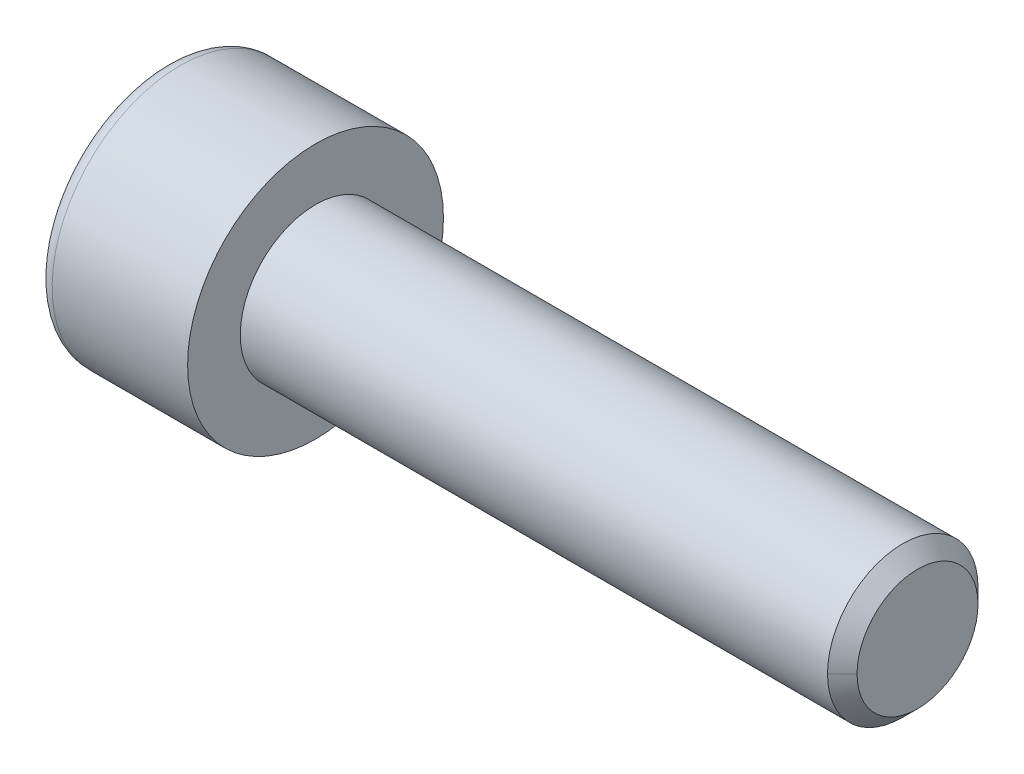
ISO-10303-21;
HEADER;
FILE_DESCRIPTION(('STEP AP214'),'2;1');
FILE_NAME('part.step','',(''),(''),'','','');
FILE_SCHEMA(('AUTOMOTIVE_DESIGN { 1 0 10303 214 1 1 1 1 }'));
ENDSEC;
DATA;
#1=APPLICATION_CONTEXT('core data for automotive mechanical design processes');
#2=APPLICATION_PROTOCOL_DEFINITION('international standard','automotive_design',2000,#1);
#3=PRODUCT_CONTEXT('',#1,'mechanical');
#4=PRODUCT('Part','Part','',(#3));
#5=PRODUCT_RELATED_PRODUCT_CATEGORY('part','',(#4));
#6=PRODUCT_DEFINITION_FORMATION('','',#4);
#7=PRODUCT_DEFINITION_CONTEXT('part definition',#1,'design');
#8=PRODUCT_DEFINITION('design','',#6,#7);
#9=PRODUCT_DEFINITION_SHAPE('','',#8);
#10=(LENGTH_UNIT() NAMED_UNIT(*) SI_UNIT(.MILLI.,.METRE.));
#11=(NAMED_UNIT(*) PLANE_ANGLE_UNIT() SI_UNIT($,.RADIAN.));
#12=(NAMED_UNIT(*) SI_UNIT($,.STERADIAN.) SOLID_ANGLE_UNIT());
#13=UNCERTAINTY_MEASURE_WITH_UNIT(LENGTH_MEASURE(1.E-05),#10,'distance_accuracy_value','');
#14=(GEOMETRIC_REPRESENTATION_CONTEXT(3) GLOBAL_UNCERTAINTY_ASSIGNED_CONTEXT((#13)) GLOBAL_UNIT_ASSIGNED_CONTEXT((#10,
#11,#12)) REPRESENTATION_CONTEXT('',''));
#15=CARTESIAN_POINT('',(0.,0.,0.));
#16=DIRECTION('',(0.,0.,1.));
#17=DIRECTION('',(1.,0.,0.));
#18=AXIS2_PLACEMENT_3D('',#15,#16,#17);
#19=CARTESIAN_POINT('',(20.,-2.03335088,-2.03335088));
#20=DIRECTION('',(1.,0.,0.));
#21=DIRECTION('',(0.,1.,0.));
#22=AXIS2_PLACEMENT_3D('',#19,#20,#21);
#23=PLANE('',#22);
#24=CARTESIAN_POINT('',(20.,0.,0.));
#25=DIRECTION('',(-1.,0.,0.));
#26=DIRECTION('',(0.,0.,1.));
#27=AXIS2_PLACEMENT_3D('',#24,#25,#26);
#28=CIRCLE('',#27,2.00924);
#29=CARTESIAN_POINT('',(20.,-6.86836687895245E-10,-2.00923999999999));
#30=VERTEX_POINT('',#29);
#31=CARTESIAN_POINT('',(20.,-2.40554743613248E-10,2.00923999999999));
#32=VERTEX_POINT('',#31);
#33=EDGE_CURVE('E88',#30,#32,#28,.F.);
#34=ORIENTED_EDGE('',*,*,#33,.T.);
#35=CARTESIAN_POINT('',(20.,0.,0.));
#36=DIRECTION('',(-1.,0.,0.));
#37=DIRECTION('',(0.,0.,1.));
#38=AXIS2_PLACEMENT_3D('',#35,#36,#37);
#39=CIRCLE('',#38,2.00924);
#40=EDGE_CURVE('E21',#32,#30,#39,.F.);
#41=ORIENTED_EDGE('',*,*,#40,.T.);
#42=EDGE_LOOP('',(#34,#41));
#43=FACE_BOUND('',#42,.T.);
#44=ADVANCED_FACE('F17',(#43),#23,.T.);
#45=CARTESIAN_POINT('',(20.,0.,2.00924));
#46=CARTESIAN_POINT('',(19.50924,0.,2.5));
#47=(BOUNDED_CURVE() B_SPLINE_CURVE(1,(#45,#46),.UNSPECIFIED.,.F.,
.F.) B_SPLINE_CURVE_WITH_KNOTS((2,2),(0.,1.00000000000004),
.UNSPECIFIED.) CURVE() GEOMETRIC_REPRESENTATION_ITEM() RATIONAL_B_SPLINE_CURVE((1.,1.)) REPRESENTATION_ITEM(''));
#48=CARTESIAN_POINT('',(1019.50924,0.,0.));
#49=DIRECTION('',(-1.,0.,0.));
#50=AXIS1_PLACEMENT('',#48,#49);
#51=SURFACE_OF_REVOLUTION('',#47,#50);
#52=ORIENTED_EDGE('',*,*,#40,.F.);
#53=DIRECTION('',(-0.707106781186547,-1.26986739101621E-10,0.707106781186548));
#54=VECTOR('',#53,1.);
#55=CARTESIAN_POINT('',(19.75462,-4.04899018551151E-10,2.25462));
#56=LINE('',#55,#54);
#57=CARTESIAN_POINT('',(19.50924,-2.244829608488E-10,2.49999999999995));
#58=VERTEX_POINT('',#57);
#59=EDGE_CURVE('E91',#32,#58,#56,.T.);
#60=ORIENTED_EDGE('',*,*,#59,.T.);
#61=CARTESIAN_POINT('',(19.5092400000001,0.,0.));
#62=DIRECTION('',(-1.,0.,0.));
#63=DIRECTION('',(0.,0.,1.));
#64=AXIS2_PLACEMENT_3D('',#61,#62,#63);
#65=CIRCLE('',#64,2.5);
#66=CARTESIAN_POINT('',(19.50924,-1.02551714257664E-09,-2.49999999999995));
#67=VERTEX_POINT('',#66);
#68=EDGE_CURVE('E95',#58,#67,#65,.F.);
#69=ORIENTED_EDGE('',*,*,#68,.T.);
#70=DIRECTION('',(0.707106781186547,2.90060050295602E-10,0.707106781186548));
#71=VECTOR('',#70,1.);
#72=CARTESIAN_POINT('',(19.75462,-9.24860583998472E-10,-2.25462));
#73=LINE('',#72,#71);
#74=EDGE_CURVE('E93',#67,#30,#73,.T.);
#75=ORIENTED_EDGE('',*,*,#74,.T.);
#76=EDGE_LOOP('',(#52,#60,#69,#75));
#77=FACE_BOUND('',#76,.T.);
#78=ADVANCED_FACE('F94',(#77),#51,.T.);
#79=CARTESIAN_POINT('',(20.0001414213562,0.,2.00909857864376));
#80=CARTESIAN_POINT('',(20.,0.,2.00924));
#81=CARTESIAN_POINT('',(19.50924,0.,2.5));
#82=(BOUNDED_CURVE() B_SPLINE_CURVE(1,(#79,#80,#81),.UNSPECIFIED.,.F.,
.F.) B_SPLINE_CURVE_WITH_KNOTS((2,1,2),(-0.00028816802109463,3.70846523719847E-11,1.),
.UNSPECIFIED.) CURVE() GEOMETRIC_REPRESENTATION_ITEM() RATIONAL_B_SPLINE_CURVE((1.,1.,1.)) REPRESENTATION_ITEM(''));
#83=CARTESIAN_POINT('',(1019.50924,0.,0.));
#84=DIRECTION('',(-1.,0.,0.));
#85=AXIS1_PLACEMENT('',#83,#84);
#86=SURFACE_OF_REVOLUTION('',#82,#85);
#87=ORIENTED_EDGE('',*,*,#74,.F.);
#88=CARTESIAN_POINT('',(19.5092400000001,0.,0.));
#89=DIRECTION('',(-1.,0.,0.));
#90=DIRECTION('',(0.,0.,1.));
#91=AXIS2_PLACEMENT_3D('',#88,#89,#90);
#92=CIRCLE('',#91,2.5);
#93=EDGE_CURVE('E108',#67,#58,#92,.F.);
#94=ORIENTED_EDGE('',*,*,#93,.T.);
#95=ORIENTED_EDGE('',*,*,#59,.F.);
#96=ORIENTED_EDGE('',*,*,#33,.F.);
#97=EDGE_LOOP('',(#87,#94,#95,#96));
#98=FACE_BOUND('',#97,.T.);
#99=ADVANCED_FACE('F101',(#98),#86,.T.);
#100=CARTESIAN_POINT('',(-1.166666666,0.,0.));
#101=CARTESIAN_POINT('',(-2.508,0.,2.323257483));
#102=(BOUNDED_CURVE() B_SPLINE_CURVE(1,(#100,#101),.UNSPECIFIED.,.F.,
.F.) B_SPLINE_CURVE_WITH_KNOTS((2,2),(0.,1.),
.UNSPECIFIED.) CURVE() GEOMETRIC_REPRESENTATION_ITEM() RATIONAL_B_SPLINE_CURVE((1.,1.)) REPRESENTATION_ITEM(''));
#103=CARTESIAN_POINT('',(997.492,0.,0.));
#104=DIRECTION('',(-1.,0.,0.));
#105=AXIS1_PLACEMENT('',#103,#104);
#106=SURFACE_OF_REVOLUTION('',#102,#105);
#107=CARTESIAN_POINT('',(-1.166666666,0.,0.));
#108=VERTEX_POINT('',#107);
#109=VERTEX_LOOP('',#108);
#110=FACE_BOUND('',#109,.T.);
#111=CARTESIAN_POINT('',(-2.49999999994076,-2.,-1.15470053775231));
#112=CARTESIAN_POINT('',(-2.48567655165512,-2.,-1.10507931773432));
#113=CARTESIAN_POINT('',(-2.47198871078964,-2.,-1.05526823641219));
#114=CARTESIAN_POINT('',(-2.44604690640692,-2.,-0.955218692575869));
#115=CARTESIAN_POINT('',(-2.43379447460794,-2.,-0.904979833791241));
#116=CARTESIAN_POINT('',(-2.41091380130688,-2.,-0.804117092943882));
#117=CARTESIAN_POINT('',(-2.40028604275163,-2.,-0.753493101073635));
#118=CARTESIAN_POINT('',(-2.37601016772818,-2.,-0.626639542162072));
#119=CARTESIAN_POINT('',(-2.36348630626666,-2.,-0.550189309523977));
#120=CARTESIAN_POINT('',(-2.34306885503139,-2.,-0.396671574205417));
#121=CARTESIAN_POINT('',(-2.33517516655927,-2.,-0.319604084718113));
#122=CARTESIAN_POINT('',(-2.32268432555711,-2.,-0.139619688842338));
#123=CARTESIAN_POINT('',(-2.32003239400898,-2.,-0.0365584864338747));
#124=CARTESIAN_POINT('',(-2.32397535370215,-2.,0.169407104774963));
#125=CARTESIAN_POINT('',(-2.33057305877728,-2.,0.272311436318865));
#126=CARTESIAN_POINT('',(-2.35234479113069,-2.,0.477116467372633));
#127=CARTESIAN_POINT('',(-2.36751355138492,-2.,0.579017744182629));
#128=CARTESIAN_POINT('',(-2.40514304704038,-2.,0.781457900875611));
#129=CARTESIAN_POINT('',(-2.42760505461591,-2.,0.881996539881626));
#130=CARTESIAN_POINT('',(-2.46035679018023,-2.,1.01073167838896));
#131=CARTESIAN_POINT('',(-2.46797293838578,-2.,1.03963527257175));
#132=CARTESIAN_POINT('',(-2.48365524704736,-2.,1.09727927796046));
#133=CARTESIAN_POINT('',(-2.49172080087081,-2.,1.12601985408537));
#134=CARTESIAN_POINT('',(-2.49999999998173,-2.,1.15470053789423));
#135=B_SPLINE_CURVE_WITH_KNOTS('',3,(#111,#112,#113,#114,#115,#116,#117,#118,#119,#120,#121,
#122,#123,#124,#125,#126,#127,#128,#129,#130,#131,#132,#133,#134),.UNSPECIFIED.,.F.,.F.,(4,2,2,
2,2,2,2,2,2,2,2,4),(0.,0.154946742163082,0.310057349590026,0.465213975574503,0.697487987448034,
0.929757047907446,1.23861321261436,1.54756335490868,1.85632384950566,2.16513823071313,
2.25480717406297,2.34435787914655),.UNSPECIFIED.);
#136=CARTESIAN_POINT('',(-2.4999999998186,-1.99999999993079,-1.15470053803996));
#137=VERTEX_POINT('',#136);
#138=CARTESIAN_POINT('',(-2.49999999995344,-1.99999999986934,1.15470053802255));
#139=VERTEX_POINT('',#138);
#140=EDGE_CURVE('E400',#137,#139,#135,.T.);
#141=ORIENTED_EDGE('',*,*,#140,.T.);
#142=CARTESIAN_POINT('',(-2.49999999992515,-1.99999999973868,1.15470053815087));
#143=CARTESIAN_POINT('',(-2.48567655163891,-1.95702676264271,1.17951114816952));
#144=CARTESIAN_POINT('',(-2.47198871077284,-1.91388910083416,1.20441668884029));
#145=CARTESIAN_POINT('',(-2.44604690638884,-1.82724365424769,1.25444146077793));
#146=CARTESIAN_POINT('',(-2.43379447458918,-1.78373552628951,1.27956089018003));
#147=CARTESIAN_POINT('',(-2.4109138012866,-1.6963858304333,1.32999226062335));
#148=CARTESIAN_POINT('',(-2.40028604273051,-1.65254416743919,1.35530425656833));
#149=CARTESIAN_POINT('',(-2.37601016770505,-1.54268576287784,1.41873103604867));
#150=CARTESIAN_POINT('',(-2.36348630624236,-1.47647791929806,1.45695615238246));
#151=CARTESIAN_POINT('',(-2.3430688550045,-1.34352766060085,1.5337150200714));
#152=CARTESIAN_POINT('',(-2.33517516653094,-1.27678525690902,1.57224876482995));
#153=CARTESIAN_POINT('',(-2.32268432552556,-1.1209141978217,1.66224096280127));
#154=CARTESIAN_POINT('',(-2.32003239397535,-1.03166057840722,1.71377156402406));
#155=CARTESIAN_POINT('',(-2.32397535366393,-0.853289144146355,1.81675435966568));
#156=CARTESIAN_POINT('',(-2.33057305873656,-0.764171378885523,1.86820652545626));
#157=CARTESIAN_POINT('',(-2.35234479108477,-0.586805019200706,1.97060904102052));
#158=CARTESIAN_POINT('',(-2.36751355133635,-0.498555924820148,2.02155967944427));
#159=CARTESIAN_POINT('',(-2.40514304698655,-0.32323760640756,2.12277975782806));
#160=CARTESIAN_POINT('',(-2.4276050545595,-0.236168590981107,2.17304907734962));
#161=CARTESIAN_POINT('',(-2.46035679014959,-0.124680690593866,2.23741664668419));
#162=CARTESIAN_POINT('',(-2.46797293838541,-0.0996494436766156,2.25186844383778));
#163=CARTESIAN_POINT('',(-2.48365524711095,-0.0497282704466456,2.28069044665586));
#164=CARTESIAN_POINT('',(-2.4917208009681,-0.024838201309885,2.29506073477984));
#165=CARTESIAN_POINT('',(-2.50000000011427,-4.40704641312993E-10,2.30940107674556));
#166=B_SPLINE_CURVE_WITH_KNOTS('',3,(#142,#143,#144,#145,#146,#147,#148,#149,#150,#151,#152,
#153,#154,#155,#156,#157,#158,#159,#160,#161,#162,#163,#164,#165),.UNSPECIFIED.,.F.,.F.,(4,2,2,
2,2,2,2,2,2,2,2,4),(0.,0.154946742161569,0.310057349586999,0.465213975569957,0.697487987440142,
0.929757047896212,1.23861321259006,1.54756335487124,1.85632384945638,2.16513823065216,
2.25480717435215,2.34435787978498),.UNSPECIFIED.);
#167=CARTESIAN_POINT('',(-2.50000000028077,-5.87977686074181E-11,2.30940107703395));
#168=VERTEX_POINT('',#167);
#169=EDGE_CURVE('E409',#139,#168,#166,.T.);
#170=ORIENTED_EDGE('',*,*,#169,.T.);
#171=CARTESIAN_POINT('',(-2.50000000016212,2.97141322209485E-10,2.30940107682845));
#172=CARTESIAN_POINT('',(-2.48567655186644,0.0429732373984809,2.2845904668067));
#173=CARTESIAN_POINT('',(-2.4719887109907,0.0861108992124214,2.25968492613282));
#174=CARTESIAN_POINT('',(-2.44604690658692,0.172756345809803,2.20966015418887));
#175=CARTESIAN_POINT('',(-2.43379447477714,0.216264473773518,2.18454072478358));
#176=CARTESIAN_POINT('',(-2.4109138014539,0.303614169640957,2.13410935433377));
#177=CARTESIAN_POINT('',(-2.40028604288728,0.347455832640779,2.1087973583855));
#178=CARTESIAN_POINT('',(-2.37601016783492,0.457314237217623,2.04537057889622));
#179=CARTESIAN_POINT('',(-2.36348630635573,0.523522080807346,2.00714546255668));
#180=CARTESIAN_POINT('',(-2.34306885508494,0.656472339525236,1.93038659485581));
#181=CARTESIAN_POINT('',(-2.33517516659494,0.723214743227788,1.89185285009106));
#182=CARTESIAN_POINT('',(-2.32268432555431,0.879085802316307,1.80186065211906));
#183=CARTESIAN_POINT('',(-2.32003239398313,0.968339421721444,1.75033005090165));
#184=CARTESIAN_POINT('',(-2.32397535362841,1.14671085596532,1.64734725526985));
#185=CARTESIAN_POINT('',(-2.3305730586787,1.2358286212185,1.59589508948368));
#186=CARTESIAN_POINT('',(-2.35234479098305,1.41319498088894,1.49349257392772));
#187=CARTESIAN_POINT('',(-2.36751355121305,1.50144407526278,1.44254193550786));
#188=CARTESIAN_POINT('',(-2.40514304682218,1.67676239366279,1.34132185713132));
#189=CARTESIAN_POINT('',(-2.42760505437561,1.76383140908338,1.29105253761314));
#190=CARTESIAN_POINT('',(-2.46035678994391,1.87531930946905,1.22668496827949));
#191=CARTESIAN_POINT('',(-2.46797293817638,1.90035055639045,1.2122331711235));
#192=CARTESIAN_POINT('',(-2.48365524689563,1.95027172962873,1.18341116830062));
#193=CARTESIAN_POINT('',(-2.49172080074984,1.97516179876965,1.16904088017424));
#194=CARTESIAN_POINT('',(-2.49999999989325,1.99999999964298,1.15470053820613));
#195=B_SPLINE_CURVE_WITH_KNOTS('',3,(#171,#172,#173,#174,#175,#176,#177,#178,#179,#180,#181,
#182,#183,#184,#185,#186,#187,#188,#189,#190,#191,#192,#193,#194),.UNSPECIFIED.,.F.,.F.,(4,2,2,
2,2,2,2,2,2,2,2,4),(0.,0.154946742187278,0.310057349638523,0.465213975647335,0.69748798755956,
0.92975704805761,1.23861321272094,1.54756335497137,1.85632384952381,2.16513823068683,
2.25480717439816,2.34435787984248),.UNSPECIFIED.);
#196=CARTESIAN_POINT('',(-2.49999999995344,1.99999999982149,1.15470053810544));
#197=VERTEX_POINT('',#196);
#198=EDGE_CURVE('E418',#168,#197,#195,.T.);
#199=ORIENTED_EDGE('',*,*,#198,.T.);
#200=CARTESIAN_POINT('',(-2.50000000001363,2.,1.15470053800475));
#201=CARTESIAN_POINT('',(-2.48567655172505,2.,1.10507931798486));
#202=CARTESIAN_POINT('',(-2.47198871085661,2.,1.05526823666081));
#203=CARTESIAN_POINT('',(-2.44604690646785,2.,0.955218692820608));
#204=CARTESIAN_POINT('',(-2.43379447466577,2.,0.904979834034012));
#205=CARTESIAN_POINT('',(-2.41091380135833,2.,0.804117093182673));
#206=CARTESIAN_POINT('',(-2.40028604279979,2.,0.753493101310414));
#207=CARTESIAN_POINT('',(-2.37601016776802,2.,0.626639542393354));
#208=CARTESIAN_POINT('',(-2.36348630630148,2.,0.550189309751709));
#209=CARTESIAN_POINT('',(-2.34306885505614,2.,0.396671574425779));
#210=CARTESIAN_POINT('',(-2.33517516657896,2.,0.319604084934656));
#211=CARTESIAN_POINT('',(-2.32268432556593,2.,0.139619689058439));
#212=CARTESIAN_POINT('',(-2.32003239401132,2.,0.0365584866532823));
#213=CARTESIAN_POINT('',(-2.32397535369116,2.,-0.169407104549539));
#214=CARTESIAN_POINT('',(-2.33057305875947,2.,-0.272311436090732));
#215=CARTESIAN_POINT('',(-2.3523447910994,2.,-0.477116467139405));
#216=CARTESIAN_POINT('',(-2.36751355134697,2.,-0.579017743947016));
#217=CARTESIAN_POINT('',(-2.40514304698976,2.,-0.781457900635529));
#218=CARTESIAN_POINT('',(-2.42760505455929,2.,-0.881996539639461));
#219=CARTESIAN_POINT('',(-2.46035679011629,2.,-1.01073167814332));
#220=CARTESIAN_POINT('',(-2.46797293832006,2.,-1.03963527232473));
#221=CARTESIAN_POINT('',(-2.48365524697808,2.,-1.0972792777107));
#222=CARTESIAN_POINT('',(-2.49172080079975,2.,-1.12601985383426));
#223=CARTESIAN_POINT('',(-2.49999999990886,2.,-1.1547005376418));
#224=B_SPLINE_CURVE_WITH_KNOTS('',3,(#200,#201,#202,#203,#204,#205,#206,#207,#208,#209,#210,
#211,#212,#213,#214,#215,#216,#217,#218,#219,#220,#221,#222,#223),.UNSPECIFIED.,.F.,.F.,(4,2,2,
2,2,2,2,2,2,2,2,4),(0.,0.154946742170985,0.310057349605864,0.465213975598284,0.697487987484767,
0.929757047957124,1.23861321265468,1.54756335493957,1.85632384952649,2.16513823072387,
2.2548071740683,2.34435787914655),.UNSPECIFIED.);
#225=CARTESIAN_POINT('',(-2.49999999995344,1.99999999997865,-1.15470053783323));
#226=VERTEX_POINT('',#225);
#227=EDGE_CURVE('E427',#197,#226,#224,.T.);
#228=ORIENTED_EDGE('',*,*,#227,.T.);
#229=CARTESIAN_POINT('',(-2.49999999999803,1.9999999999573,-1.15470053802466));
#230=CARTESIAN_POINT('',(-2.48567655170877,1.95702676285955,-1.17951114804433));
#231=CARTESIAN_POINT('',(-2.4719887108397,1.9138891010492,-1.20441668871613));
#232=CARTESIAN_POINT('',(-2.44604690644962,1.8272436544591,-1.25444146065587));
#233=CARTESIAN_POINT('',(-2.43379447464687,1.78373552649906,-1.27956089005904));
#234=CARTESIAN_POINT('',(-2.41091380133792,1.69638583063912,-1.32999226050452));
#235=CARTESIAN_POINT('',(-2.40028604277855,1.65254416764312,-1.35530425645059));
#236=CARTESIAN_POINT('',(-2.37601016774484,1.54268576307708,-1.41873103593363));
#237=CARTESIAN_POINT('',(-2.36348630627713,1.47647791949446,-1.45695615226908));
#238=CARTESIAN_POINT('',(-2.34306885502922,1.34352766079131,-1.53371501996143));
#239=CARTESIAN_POINT('',(-2.33517516655063,1.2767852570964,-1.57224876472177));
#240=CARTESIAN_POINT('',(-2.32268432553439,1.12091419800915,-1.66224096269304));
#241=CARTESIAN_POINT('',(-2.32003239397769,1.03166057859777,-1.71377156391405));
#242=CARTESIAN_POINT('',(-2.32397535365287,0.853289144342585,-1.81675435955238));
#243=CARTESIAN_POINT('',(-2.33057305871859,0.76417137908434,-1.86820652534147));
#244=CARTESIAN_POINT('',(-2.35234479105324,0.586805019403965,-1.97060904090317));
#245=CARTESIAN_POINT('',(-2.3675135512982,0.498555925025262,-2.02155967932584));
#246=CARTESIAN_POINT('',(-2.40514304693586,0.323237606616101,-2.12277975770766));
#247=CARTESIAN_POINT('',(-2.42760505450289,0.236168591191219,-2.17304907722831));
#248=CARTESIAN_POINT('',(-2.46035679011618,0.124680690702564,-2.23741664662143));
#249=CARTESIAN_POINT('',(-2.4679729383828,0.0996494436828631,-2.25186844383417));
#250=CARTESIAN_POINT('',(-2.48365524717361,0.0497282702491337,-2.28069044676989));
#251=CARTESIAN_POINT('',(-2.49172080106521,0.0248382010110627,-2.29506073495237));
#252=CARTESIAN_POINT('',(-2.5000000002475,4.09998984578272E-11,-2.30940107697633));
#253=B_SPLINE_CURVE_WITH_KNOTS('',3,(#229,#230,#231,#232,#233,#234,#235,#236,#237,#238,#239,
#240,#241,#242,#243,#244,#245,#246,#247,#248,#249,#250,#251,#252),.UNSPECIFIED.,.F.,.F.,(4,2,2,
2,2,2,2,2,2,2,2,4),(0.,0.154946742169962,0.310057349603811,0.465213975595197,0.697487987477565,
0.929757047945802,1.23861321262949,1.5475633549004,1.8563238494762,2.16513823066278,
2.25480717472947,2.34435788052809),.UNSPECIFIED.);
#254=CARTESIAN_POINT('',(-2.50000000026117,-9.47332157419396E-10,-2.309401077));
#255=VERTEX_POINT('',#254);
#256=EDGE_CURVE('E436',#226,#255,#253,.T.);
#257=ORIENTED_EDGE('',*,*,#256,.T.);
#258=CARTESIAN_POINT('',(-2.50000000002889,-6.96845553583441E-10,-2.30940107659768));
#259=CARTESIAN_POINT('',(-2.48567655173841,-0.0429732377951086,-2.28459046657771));
#260=CARTESIAN_POINT('',(-2.47198871086813,-0.0861108996059853,-2.2596849259056));
#261=CARTESIAN_POINT('',(-2.4460469064756,-0.172756346197175,-2.20966015396523));
#262=CARTESIAN_POINT('',(-2.4337944746716,-0.216264474157762,-2.18454072456174));
#263=CARTESIAN_POINT('',(-2.41091380136002,-0.303614170018815,-2.13410935411562));
#264=CARTESIAN_POINT('',(-2.40028604279926,-0.347455833015379,-2.10879735816922));
#265=CARTESIAN_POINT('',(-2.37601016776189,-0.457314237583502,-2.04537057868498));
#266=CARTESIAN_POINT('',(-2.36348630629192,-0.523522081167679,-2.00714546234864));
#267=CARTESIAN_POINT('',(-2.34306885503964,-0.65647233987405,-1.93038659465442));
#268=CARTESIAN_POINT('',(-2.33517516655893,-0.72321474357063,-1.89185284989312));
#269=CARTESIAN_POINT('',(-2.32268432553819,-0.879085802658592,-1.80186065192144));
#270=CARTESIAN_POINT('',(-2.3200323939788,-0.968339422069034,-1.75033005070097));
#271=CARTESIAN_POINT('',(-2.32397535364841,-1.14671085632258,-1.64734725506358));
#272=CARTESIAN_POINT('',(-2.33057305871125,-1.23582862158012,-1.5958950892749));
#273=CARTESIAN_POINT('',(-2.35234479104024,-1.41319498125865,-1.49349257371427));
#274=CARTESIAN_POINT('',(-2.36751355128237,-1.50144407563621,-1.44254193529225));
#275=CARTESIAN_POINT('',(-2.4051430469146,-1.67676239404317,-1.34132185691171));
#276=CARTESIAN_POINT('',(-2.42760505447902,-1.763831409467,-1.29105253739166));
#277=CARTESIAN_POINT('',(-2.46035679005192,-1.87531930982753,-1.22668496807252));
#278=CARTESIAN_POINT('',(-2.46797293827813,-1.90035055672077,-1.21223317093279));
#279=CARTESIAN_POINT('',(-2.48365524698376,-1.950271729903,-1.18341116814227));
#280=CARTESIAN_POINT('',(-2.49172080083059,-1.97516179901603,-1.16904088003199));
#281=CARTESIAN_POINT('',(-2.49999999996612,-1.99999999986159,-1.15470053807991));
#282=B_SPLINE_CURVE_WITH_KNOTS('',3,(#258,#259,#260,#261,#262,#263,#264,#265,#266,#267,#268,
#269,#270,#271,#272,#273,#274,#275,#276,#277,#278,#279,#280,#281),.UNSPECIFIED.,.F.,.F.,(4,2,2,
2,2,2,2,2,2,2,2,4),(0.,0.154946742172695,0.310057349609295,0.465213975603437,0.697487987492204,
0.929757047966837,1.23861321264752,1.54756335491544,1.85632384948608,2.1651382306673,
2.2548071742795,2.34435787962486),.UNSPECIFIED.);
#283=EDGE_CURVE('E439',#255,#137,#282,.T.);
#284=ORIENTED_EDGE('',*,*,#283,.T.);
#285=EDGE_LOOP('',(#141,#170,#199,#228,#257,#284));
#286=FACE_BOUND('',#285,.T.);
#287=ADVANCED_FACE('F180',(#110,#286),#106,.F.);
#288=CARTESIAN_POINT('',(0.,2.5,0.));
#289=CARTESIAN_POINT('',(19.50924,2.5,0.));
#290=(BOUNDED_CURVE() B_SPLINE_CURVE(1,(#288,#289),.UNSPECIFIED.,.F.,
.F.) B_SPLINE_CURVE_WITH_KNOTS((2,2),(0.,1.),
.UNSPECIFIED.) CURVE() GEOMETRIC_REPRESENTATION_ITEM() RATIONAL_B_SPLINE_CURVE((1.,1.)) REPRESENTATION_ITEM(''));
#291=CARTESIAN_POINT('',(11.2,0.,0.));
#292=DIRECTION('',(1.,0.,0.));
#293=AXIS1_PLACEMENT('',#291,#292);
#294=SURFACE_OF_REVOLUTION('',#290,#293);
#295=CARTESIAN_POINT('',(0.,2.5,-1.49654235150772E-10));
#296=CARTESIAN_POINT('',(0.,2.49999957935712,-0.0701921601458648));
#297=CARTESIAN_POINT('',(0.,2.49704119341874,-0.140397219847306));
#298=CARTESIAN_POINT('',(0.,2.48522688335223,-0.280322179338116));
#299=CARTESIAN_POINT('',(0.,2.47636921808606,-0.350041929750869));
#300=CARTESIAN_POINT('',(0.,2.45279620031375,-0.488604766662132));
#301=CARTESIAN_POINT('',(0.,2.43807154939718,-0.557446281672286));
#302=CARTESIAN_POINT('',(0.,2.40286605984876,-0.693682439725407));
#303=CARTESIAN_POINT('',(0.,2.3823805500333,-0.761075860650563));
#304=CARTESIAN_POINT('',(0.,2.3125659555721,-0.960073508686272));
#305=CARTESIAN_POINT('',(0.,2.25482146131052,-1.0888300172892));
#306=CARTESIAN_POINT('',(0.,2.11850508049911,-1.33480670440696));
#307=CARTESIAN_POINT('',(0.,2.03993240221167,-1.45202644414458));
#308=CARTESIAN_POINT('',(0.,1.90824104287933,-1.61665670252642));
#309=CARTESIAN_POINT('',(0.,1.86200376385574,-1.66969790920959));
#310=CARTESIAN_POINT('',(0.,1.76526174320805,-1.77166010130448));
#311=CARTESIAN_POINT('',(0.,1.71476115904218,-1.82058500992368));
#312=CARTESIAN_POINT('',(0.,1.60979378908777,-1.91402800851678));
#313=CARTESIAN_POINT('',(0.,1.55532521700593,-1.95854409219933));
#314=CARTESIAN_POINT('',(0.,1.44283652725317,-2.04283394027423));
#315=CARTESIAN_POINT('',(0.,1.384815589926,-2.08260660390377));
#316=CARTESIAN_POINT('',(0.,1.20605688640292,-2.19433902063112));
#317=CARTESIAN_POINT('',(0.,1.08051229837999,-2.25881176841051));
#318=CARTESIAN_POINT('',(0.,0.820448664808011,-2.36572576693554));
#319=CARTESIAN_POINT('',(0.,0.68592971512666,-2.40816725298534));
#320=CARTESIAN_POINT('',(0.,0.411658452676093,-2.46987540916738));
#321=CARTESIAN_POINT('',(0.,0.271906111962458,-2.48914195553559));
#322=CARTESIAN_POINT('',(0.,-0.00884938366135953,-2.50393336511555));
#323=CARTESIAN_POINT('',(0.,-0.149852538571541,-2.4994582283273));
#324=CARTESIAN_POINT('',(0.,-0.429089566460181,-2.46691127452929));
#325=CARTESIAN_POINT('',(0.,-0.567323454223614,-2.43883958353471));
#326=CARTESIAN_POINT('',(0.,-0.837181598048732,-2.35984414823284));
#327=CARTESIAN_POINT('',(0.,-0.968805783498485,-2.30892015985052));
#328=CARTESIAN_POINT('',(0.,-1.15831539859643,-2.21658970540334));
#329=CARTESIAN_POINT('',(0.,-1.22019432815808,-2.18313388353604));
#330=CARTESIAN_POINT('',(0.,-1.34091721232836,-2.11113062632916));
#331=CARTESIAN_POINT('',(0.,-1.39976186639087,-2.07258437178567));
#332=CARTESIAN_POINT('',(0.,-1.51396685336594,-1.99068831759965));
#333=CARTESIAN_POINT('',(0.,-1.56932875186804,-1.9473407008401));
#334=CARTESIAN_POINT('',(0.,-1.6762490953027,-1.85610831988026));
#335=CARTESIAN_POINT('',(0.,-1.72780381803106,-1.8082192173379));
#336=CARTESIAN_POINT('',(0.,-1.87606499403363,-1.65833806512721));
#337=CARTESIAN_POINT('',(0.,-1.96651979569876,-1.55002342155054));
#338=CARTESIAN_POINT('',(0.,-2.12792802530579,-1.31973215011787));
#339=CARTESIAN_POINT('',(0.,-2.19888219449693,-1.19775604180344));
#340=CARTESIAN_POINT('',(0.,-2.28922037065546,-1.00719593199043));
#341=CARTESIAN_POINT('',(0.,-2.31667397069351,-0.942328149992189));
#342=CARTESIAN_POINT('',(0.,-2.36599984787504,-0.810545468672519));
#343=CARTESIAN_POINT('',(0.,-2.38787664192646,-0.743632275537157));
#344=CARTESIAN_POINT('',(0.,-2.42587892397024,-0.60831349081281));
#345=CARTESIAN_POINT('',(0.,-2.44201349377068,-0.539910439061319));
#346=CARTESIAN_POINT('',(0.,-2.46846529093155,-0.402001503028459));
#347=CARTESIAN_POINT('',(0.,-2.47878423409518,-0.332495950250272));
#348=CARTESIAN_POINT('',(0.,-2.49076983986528,-0.219068891475801));
#349=CARTESIAN_POINT('',(0.,-2.49423005455374,-0.175328990224659));
#350=CARTESIAN_POINT('',(0.,-2.49884526605357,-0.0877277389086183));
#351=CARTESIAN_POINT('',(0.,-2.50000026286494,-0.0438663888437195));
#352=CARTESIAN_POINT('',(0.,-2.49999957938051,0.0701921593121999));
#353=CARTESIAN_POINT('',(0.,-2.49704119346556,0.140397219014432));
#354=CARTESIAN_POINT('',(0.,-2.48522688344576,0.280322178508837));
#355=CARTESIAN_POINT('',(0.,-2.47636921820289,0.350041928924395));
#356=CARTESIAN_POINT('',(0.,-2.45279620047681,0.488604765843589));
#357=CARTESIAN_POINT('',(0.,-2.43807154958317,0.557446280858868));
#358=CARTESIAN_POINT('',(0.,-2.40286606008009,0.693682438924112));
#359=CARTESIAN_POINT('',(0.,-2.38238055028705,0.761075859856269));
#360=CARTESIAN_POINT('',(0.,-2.31256595589212,0.960073507915408));
#361=CARTESIAN_POINT('',(0.,-2.25482146167347,1.08883001653758));
#362=CARTESIAN_POINT('',(0.,-2.11850508094405,1.33480670370078));
#363=CARTESIAN_POINT('',(0.,-2.03993240269569,1.4520264434646));
#364=CARTESIAN_POINT('',(0.,-1.90824104341822,1.61665670189033));
#365=CARTESIAN_POINT('',(0.,-1.86200376441232,1.66969790858891));
#366=CARTESIAN_POINT('',(0.,-1.76526174379863,1.77166010071603));
#367=CARTESIAN_POINT('',(0.,-1.71476115964908,1.82058500935205));
#368=CARTESIAN_POINT('',(0.,-1.60979378972582,1.91402800798015));
#369=CARTESIAN_POINT('',(0.,-1.55532521765881,1.95854409168086));
#370=CARTESIAN_POINT('',(0.,-1.44283652793413,2.04283393979327));
#371=CARTESIAN_POINT('',(0.,-1.38481559062022,2.08260660344216));
#372=CARTESIAN_POINT('',(0.,-1.20605688713436,2.1943390202291));
#373=CARTESIAN_POINT('',(0.,-1.08051229913292,2.25881176805034));
#374=CARTESIAN_POINT('',(0.,-0.820448665596577,2.36572576666206));
#375=CARTESIAN_POINT('',(0.,-0.685929715929377,2.4081672527567));
#376=CARTESIAN_POINT('',(0.,-0.411658453499385,2.46987540903016));
#377=CARTESIAN_POINT('',(0.,-0.271906112792173,2.48914195544496));
#378=CARTESIAN_POINT('',(0.,0.00884938282671448,2.5039333651185));
#379=CARTESIAN_POINT('',(0.,0.149852537738389,2.49945822837725));
#380=CARTESIAN_POINT('',(0.,0.429089565637883,2.46691127467232));
#381=CARTESIAN_POINT('',(0.,0.567323453410678,2.43883958372382));
#382=CARTESIAN_POINT('',(0.,0.837181597262127,2.3598441485119));
#383=CARTESIAN_POINT('',(0.,0.96880578272885,2.30892016017345));
#384=CARTESIAN_POINT('',(0.,1.15831539785756,2.21658970578945));
#385=CARTESIAN_POINT('',(0.,1.22019432743035,2.18313388394278));
#386=CARTESIAN_POINT('',(0.,1.34091721162461,2.11113062677616));
#387=CARTESIAN_POINT('',(0.,1.39976186569996,2.07258437225229));
#388=CARTESIAN_POINT('',(0.,1.51396685270234,1.99068831810434));
#389=CARTESIAN_POINT('',(0.,1.56932875121889,1.94734070136324));
#390=CARTESIAN_POINT('',(0.,1.67624909468398,1.85610832043902));
#391=CARTESIAN_POINT('',(0.,1.72780381742831,1.80821921791384));
#392=CARTESIAN_POINT('',(0.,1.87606499348084,1.65833806575257));
#393=CARTESIAN_POINT('',(0.,1.96651979518207,1.55002342220605));
#394=CARTESIAN_POINT('',(0.,2.12792802486587,1.31973215082719));
#395=CARTESIAN_POINT('',(0.,2.19888219409767,1.1977560425364));
#396=CARTESIAN_POINT('',(0.,2.28922037031965,1.00719593275366));
#397=CARTESIAN_POINT('',(0.,2.31667397037926,0.94232815076474));
#398=CARTESIAN_POINT('',(0.,2.36599984760461,0.81054546946189));
#399=CARTESIAN_POINT('',(0.,2.38787664167829,0.743632276334034));
#400=CARTESIAN_POINT('',(0.,2.42587892376722,0.608313491622433));
#401=CARTESIAN_POINT('',(0.,2.44201349359052,0.539910439876178));
#402=CARTESIAN_POINT('',(0.,2.46846529079747,0.402001503851803));
#403=CARTESIAN_POINT('',(0.,2.47878423398432,0.332495951076863));
#404=CARTESIAN_POINT('',(0.,2.49076983982144,0.219068892029811));
#405=CARTESIAN_POINT('',(0.,2.49423005453912,0.175328990502049));
#406=CARTESIAN_POINT('',(0.,2.49884526606818,0.0877277386312288));
#407=CARTESIAN_POINT('',(0.,2.50000026287956,0.043866388288171));
#408=CARTESIAN_POINT('',(0.,2.5,-1.49654235150772E-10));
#409=B_SPLINE_CURVE_WITH_KNOTS('',3,(#295,#296,#297,#298,#299,#300,#301,#302,#303,#304,#305,
#306,#307,#308,#309,#310,#311,#312,#313,#314,#315,#316,#317,#318,#319,#320,#321,#322,#323,#324,
#325,#326,#327,#328,#329,#330,#331,#332,#333,#334,#335,#336,#337,#338,#339,#340,#341,#342,#343,
#344,#345,#346,#347,#348,#349,#350,#351,#352,#353,#354,#355,#356,#357,#358,#359,#360,#361,#362,
#363,#364,#365,#366,#367,#368,#369,#370,#371,#372,#373,#374,#375,#376,#377,#378,#379,#380,#381,
#382,#383,#384,#385,#386,#387,#388,#389,#390,#391,#392,#393,#394,#395,#396,#397,#398,#399,#400,
#401,#402,#403,#404,#405,#406,#407,#408),.UNSPECIFIED.,.T.,.F.,(4,2,2,2,2,2,2,2,2,2,2,2,2,2,2,2,
2,2,2,2,2,2,2,2,2,2,2,2,2,2,2,2,2,2,2,2,2,2,2,2,2,2,2,2,2,2,2,2,2,2,2,2,2,2,2,2,4),(0.,
0.210536096820452,0.421134359699887,0.632067729618859,0.843172630152281,1.26437611909931,
1.6855956214669,1.89648135010458,2.1071637531372,2.31794159353163,2.52876825245848,
2.94998199754241,3.3711912437741,3.79240273943195,4.2136142350898,4.63482348132148,
5.05603722640542,5.26686388533231,5.47764172572677,5.68832412875935,5.89920985739701,
6.32042935976462,6.74163284871162,6.95273774924558,7.16367111916518,7.37426938204421,
7.5848054788639,7.71637940599957,7.84795333313523,8.05848942995493,8.26908769283395,
8.48002106275356,8.69112596328751,9.11232945223451,9.53354895460213,9.74443468323978,
9.95511708627237,10.1658949266668,10.3767215855937,10.7979353306777,11.2191445769093,
11.6403560725672,12.061567568225,12.4827768144567,12.9039905595407,13.1148172184675,
13.3255950588619,13.5362774618946,13.7471631905322,14.1683826928998,14.5895861818469,
14.8006910823803,15.0116244522992,15.2222227151787,15.4327588119991,15.5643327399678,
15.6959066679366),.UNSPECIFIED.);
#410=CARTESIAN_POINT('',(0.,2.5,-1.49654235150772E-10));
#411=VERTEX_POINT('',#410);
#412=EDGE_CURVE('E384',#411,#411,#409,.T.);
#413=ORIENTED_EDGE('',*,*,#412,.F.);
#414=EDGE_LOOP('',(#413));
#415=FACE_BOUND('',#414,.T.);
#416=ORIENTED_EDGE('',*,*,#68,.F.);
#417=ORIENTED_EDGE('',*,*,#93,.F.);
#418=EDGE_LOOP('',(#416,#417));
#419=FACE_BOUND('',#418,.T.);
#420=ADVANCED_FACE('F173',(#415,#419),#294,.T.);
#421=CARTESIAN_POINT('',(-5.,-2.,-1.154700538));
#422=DIRECTION('',(0.,-0.500000000201594,-0.866025403668048));
#423=DIRECTION('',(0.,0.866025403668048,-0.500000000201594));
#424=AXIS2_PLACEMENT_3D('',#421,#422,#423);
#425=PLANE('',#424);
#426=DIRECTION('',(0.,0.866025403668048,-0.500000000201594));
#427=VECTOR('',#426,1.);
#428=CARTESIAN_POINT('',(-5.,-2.00000000003796,-1.15470053797809));
#429=LINE('',#428,#427);
#430=CARTESIAN_POINT('',(-5.,-2.,-1.154700538));
#431=VERTEX_POINT('',#430);
#432=CARTESIAN_POINT('',(-5.,0.,-2.309401077));
#433=VERTEX_POINT('',#432);
#434=EDGE_CURVE('E380',#431,#433,#429,.T.);
#435=ORIENTED_EDGE('',*,*,#434,.F.);
#436=DIRECTION('',(1.,0.,0.));
#437=VECTOR('',#436,1.);
#438=CARTESIAN_POINT('',(-5.,-2.,-1.154700538));
#439=LINE('',#438,#437);
#440=EDGE_CURVE('E390',#431,#137,#439,.T.);
#441=ORIENTED_EDGE('',*,*,#440,.T.);
#442=ORIENTED_EDGE('',*,*,#283,.F.);
#443=DIRECTION('',(1.,0.,0.));
#444=VECTOR('',#443,1.);
#445=CARTESIAN_POINT('',(-5.,0.,-2.309401077));
#446=LINE('',#445,#444);
#447=EDGE_CURVE('E430',#255,#433,#446,.F.);
#448=ORIENTED_EDGE('',*,*,#447,.T.);
#449=EDGE_LOOP('',(#435,#441,#442,#448));
#450=FACE_BOUND('',#449,.T.);
#451=ADVANCED_FACE('F179',(#450),#425,.F.);
#452=CARTESIAN_POINT('',(-5.,0.,-2.309401077));
#453=DIRECTION('',(0.,0.500000000201594,-0.866025403668048));
#454=DIRECTION('',(0.,0.866025403668048,0.500000000201594));
#455=AXIS2_PLACEMENT_3D('',#452,#453,#454);
#456=PLANE('',#455);
#457=DIRECTION('',(0.,0.866025403668048,0.500000000201594));
#458=VECTOR('',#457,1.);
#459=CARTESIAN_POINT('',(-5.,3.31831350591782E-10,-2.30940107680842));
#460=LINE('',#459,#458);
#461=CARTESIAN_POINT('',(-5.,2.,-1.154700538));
#462=VERTEX_POINT('',#461);
#463=EDGE_CURVE('E375',#433,#462,#460,.T.);
#464=ORIENTED_EDGE('',*,*,#463,.F.);
#465=ORIENTED_EDGE('',*,*,#447,.F.);
#466=ORIENTED_EDGE('',*,*,#256,.F.);
#467=DIRECTION('',(1.,0.,0.));
#468=VECTOR('',#467,1.);
#469=CARTESIAN_POINT('',(-5.,2.,-1.154700538));
#470=LINE('',#469,#468);
#471=EDGE_CURVE('E421',#226,#462,#470,.F.);
#472=ORIENTED_EDGE('',*,*,#471,.T.);
#473=EDGE_LOOP('',(#464,#465,#466,#472));
#474=FACE_BOUND('',#473,.T.);
#475=ADVANCED_FACE('F237',(#474),#456,.F.);
#476=CARTESIAN_POINT('',(-5.,2.,-1.154700538));
#477=DIRECTION('',(0.,1.,0.));
#478=DIRECTION('',(0.,0.,1.));
#479=AXIS2_PLACEMENT_3D('',#476,#477,#478);
#480=PLANE('',#479);
#481=DIRECTION('',(0.,0.,1.));
#482=VECTOR('',#481,1.);
#483=CARTESIAN_POINT('',(-5.,2.,-3.795051151));
#484=LINE('',#483,#482);
#485=CARTESIAN_POINT('',(-5.,2.,1.154700538));
#486=VERTEX_POINT('',#485);
#487=EDGE_CURVE('E370',#462,#486,#484,.T.);
#488=ORIENTED_EDGE('',*,*,#487,.F.);
#489=ORIENTED_EDGE('',*,*,#471,.F.);
#490=ORIENTED_EDGE('',*,*,#227,.F.);
#491=DIRECTION('',(1.,0.,0.));
#492=VECTOR('',#491,1.);
#493=CARTESIAN_POINT('',(-5.,2.,1.154700538));
#494=LINE('',#493,#492);
#495=EDGE_CURVE('E412',#197,#486,#494,.F.);
#496=ORIENTED_EDGE('',*,*,#495,.T.);
#497=EDGE_LOOP('',(#488,#489,#490,#496));
#498=FACE_BOUND('',#497,.T.);
#499=ADVANCED_FACE('F248',(#498),#480,.F.);
#500=CARTESIAN_POINT('',(-5.,2.,1.154700538));
#501=DIRECTION('',(0.,0.500000000201594,0.866025403668048));
#502=DIRECTION('',(0.,-0.866025403668048,0.500000000201594));
#503=AXIS2_PLACEMENT_3D('',#500,#501,#502);
#504=PLANE('',#503);
#505=DIRECTION('',(0.,-0.866025403668048,0.500000000201594));
#506=VECTOR('',#505,1.);
#507=CARTESIAN_POINT('',(-5.,1.99999999790092,1.15470053921191));
#508=LINE('',#507,#506);
#509=CARTESIAN_POINT('',(-5.,0.,2.309401077));
#510=VERTEX_POINT('',#509);
#511=EDGE_CURVE('E365',#486,#510,#508,.T.);
#512=ORIENTED_EDGE('',*,*,#511,.F.);
#513=ORIENTED_EDGE('',*,*,#495,.F.);
#514=ORIENTED_EDGE('',*,*,#198,.F.);
#515=DIRECTION('',(1.,0.,0.));
#516=VECTOR('',#515,1.);
#517=CARTESIAN_POINT('',(-5.,0.,2.309401077));
#518=LINE('',#517,#516);
#519=EDGE_CURVE('E403',#168,#510,#518,.F.);
#520=ORIENTED_EDGE('',*,*,#519,.T.);
#521=EDGE_LOOP('',(#512,#513,#514,#520));
#522=FACE_BOUND('',#521,.T.);
#523=ADVANCED_FACE('F260',(#522),#504,.F.);
#524=CARTESIAN_POINT('',(-5.,0.,2.309401077));
#525=DIRECTION('',(0.,-0.500000000201594,0.866025403668048));
#526=DIRECTION('',(0.,-0.866025403668048,-0.500000000201594));
#527=AXIS2_PLACEMENT_3D('',#524,#525,#526);
#528=PLANE('',#527);
#529=DIRECTION('',(0.,-0.866025403668048,-0.500000000201594));
#530=VECTOR('',#529,1.);
#531=CARTESIAN_POINT('',(-5.,3.22366829411114E-09,2.30940107886119));
#532=LINE('',#531,#530);
#533=CARTESIAN_POINT('',(-5.,-2.,1.154700538));
#534=VERTEX_POINT('',#533);
#535=EDGE_CURVE('E360',#510,#534,#532,.T.);
#536=ORIENTED_EDGE('',*,*,#535,.F.);
#537=ORIENTED_EDGE('',*,*,#519,.F.);
#538=ORIENTED_EDGE('',*,*,#169,.F.);
#539=DIRECTION('',(1.,0.,0.));
#540=VECTOR('',#539,1.);
#541=CARTESIAN_POINT('',(-5.,-2.,1.154700538));
#542=LINE('',#541,#540);
#543=EDGE_CURVE('E37',#139,#534,#542,.F.);
#544=ORIENTED_EDGE('',*,*,#543,.T.);
#545=EDGE_LOOP('',(#536,#537,#538,#544));
#546=FACE_BOUND('',#545,.T.);
#547=ADVANCED_FACE('F272',(#546),#528,.F.);
#548=CARTESIAN_POINT('',(-5.,-2.,1.154700538));
#549=DIRECTION('',(0.,-1.,0.));
#550=DIRECTION('',(0.,0.,-1.));
#551=AXIS2_PLACEMENT_3D('',#548,#549,#550);
#552=PLANE('',#551);
#553=DIRECTION('',(0.,0.,1.));
#554=VECTOR('',#553,1.);
#555=CARTESIAN_POINT('',(-5.,-2.,-3.795051151));
#556=LINE('',#555,#554);
#557=EDGE_CURVE('E353',#534,#431,#556,.F.);
#558=ORIENTED_EDGE('',*,*,#557,.F.);
#559=ORIENTED_EDGE('',*,*,#543,.F.);
#560=ORIENTED_EDGE('',*,*,#140,.F.);
#561=ORIENTED_EDGE('',*,*,#440,.F.);
#562=EDGE_LOOP('',(#558,#559,#560,#561));
#563=FACE_BOUND('',#562,.T.);
#564=ADVANCED_FACE('F284',(#563),#552,.F.);
#565=CARTESIAN_POINT('',(0.,-4.301,-4.301));
#566=DIRECTION('',(1.,0.,0.));
#567=DIRECTION('',(0.,1.,0.));
#568=AXIS2_PLACEMENT_3D('',#565,#566,#567);
#569=PLANE('',#568);
#570=ORIENTED_EDGE('',*,*,#412,.T.);
#571=EDGE_LOOP('',(#570));
#572=FACE_BOUND('',#571,.T.);
#573=CARTESIAN_POINT('',(0.,-4.25,-1.16225321722163E-09));
#574=CARTESIAN_POINT('',(0.,-4.24999928492129,-0.119326673137895));
#575=CARTESIAN_POINT('',(0.,-4.24497002896787,-0.238675274566643));
#576=CARTESIAN_POINT('',(0.,-4.22488570138994,-0.47654770585784));
#577=CARTESIAN_POINT('',(0.,-4.20982766983057,-0.595071281780124));
#578=CARTESIAN_POINT('',(0.,-4.16975354114583,-0.830628103911452));
#579=CARTESIAN_POINT('',(0.,-4.14472163672711,-0.947658678588604));
#580=CARTESIAN_POINT('',(0.,-4.08487229853426,-1.17926014954632));
#581=CARTESIAN_POINT('',(0.,-4.05004692373967,-1.29382896822982));
#582=CARTESIAN_POINT('',(0.,-3.93136214615244,-1.63212495710927));
#583=CARTESIAN_POINT('',(0.,-3.83319660402291,-1.85101098384897));
#584=CARTESIAN_POINT('',(0.,-3.60145851616878,-2.26917144462438));
#585=CARTESIAN_POINT('',(0.,-3.46788462447367,-2.46844513274524));
#586=CARTESIAN_POINT('',(0.,-3.24401000198782,-2.74831630639258));
#587=CARTESIAN_POINT('',(0.,-3.1654070571619,-2.83848619205175));
#588=CARTESIAN_POINT('',(0.,-3.00094430423243,-3.01182242689419));
#589=CARTESIAN_POINT('',(0.,-2.91509156590629,-3.09499544472077));
#590=CARTESIAN_POINT('',(0.,-2.73665184564734,-3.25384668741525));
#591=CARTESIAN_POINT('',(0.,-2.64406183077576,-3.32952150013759));
#592=CARTESIAN_POINT('',(0.,-2.45281313093582,-3.47282115695692));
#593=CARTESIAN_POINT('',(0.,-2.3541530453617,-3.54044413253064));
#594=CARTESIAN_POINT('',(0.,-2.15152008560341,-3.66711506864951));
#595=CARTESIAN_POINT('',(0.,-2.04754901699385,-3.72616591757393));
#596=CARTESIAN_POINT('',(0.,-1.83496550969577,-3.83532077178945));
#597=CARTESIAN_POINT('',(0.,-1.72635137483909,-3.88542147226474));
#598=CARTESIAN_POINT('',(0.,-1.50532211410665,-3.97627595691074));
#599=CARTESIAN_POINT('',(0.,-1.39290845569259,-4.01703330341474));
#600=CARTESIAN_POINT('',(0.,-1.16503541128747,-4.08894740155107));
#601=CARTESIAN_POINT('',(0.,-1.04957490130445,-4.12010055486383));
#602=CARTESIAN_POINT('',(0.,-0.699951604652316,-4.19875108393282));
#603=CARTESIAN_POINT('',(0.,-0.4623072993195,-4.23153779940801));
#604=CARTESIAN_POINT('',(0.,0.0151108630208044,-4.25669024579446));
#605=CARTESIAN_POINT('',(0.,0.254884720028293,-4.24905597670571));
#606=CARTESIAN_POINT('',(0.,0.610836893334996,-4.20757820430926));
#607=CARTESIAN_POINT('',(0.,0.728931703409241,-4.18872975184243));
#608=CARTESIAN_POINT('',(0.,0.963099778871863,-4.14115797122255));
#609=CARTESIAN_POINT('',(0.,1.07917378392939,-4.11243833957477));
#610=CARTESIAN_POINT('',(0.,1.30852616058712,-4.04531190065783));
#611=CARTESIAN_POINT('',(0.,1.42180344716852,-4.00690139657971));
#612=CARTESIAN_POINT('',(0.,1.64467977257872,-3.92068844311206));
#613=CARTESIAN_POINT('',(0.,1.75428015092584,-3.87288945847139));
#614=CARTESIAN_POINT('',(0.,1.96910155081678,-3.76821181717898));
#615=CARTESIAN_POINT('',(0.,2.07432108028362,-3.71133009841348));
#616=CARTESIAN_POINT('',(0.,2.27956853795426,-3.5889195680055));
#617=CARTESIAN_POINT('',(0.,2.37959766267146,-3.52339276171374));
#618=CARTESIAN_POINT('',(0.,2.57374116351765,-3.38417080887994));
#619=CARTESIAN_POINT('',(0.,2.66785819725746,-3.31047937428616));
#620=CARTESIAN_POINT('',(0.,2.84962414497178,-3.15538395958284));
#621=CARTESIAN_POINT('',(0.,2.93726672902729,-3.07397260487625));
#622=CARTESIAN_POINT('',(0.,3.18931001564585,-2.81917483780904));
#623=CARTESIAN_POINT('',(0.,3.34308352884945,-2.63503984939865));
#624=CARTESIAN_POINT('',(0.,3.61747776789566,-2.24354462095206));
#625=CARTESIAN_POINT('',(0.,3.73809975387914,-2.03618526413191));
#626=CARTESIAN_POINT('',(0.,3.89167461905309,-1.71223308662747));
#627=CARTESIAN_POINT('',(0.,3.93834574746094,-1.60195785496902));
#628=CARTESIAN_POINT('',(0.,4.02219974473963,-1.37792729506121));
#629=CARTESIAN_POINT('',(0.,4.05939029236257,-1.26417486732586));
#630=CARTESIAN_POINT('',(0.,4.12399417015407,-1.03413293372069));
#631=CARTESIAN_POINT('',(0.,4.15142293939185,-0.917847745575823));
#632=CARTESIAN_POINT('',(0.,4.19639099494392,-0.683402554193643));
#633=CARTESIAN_POINT('',(0.,4.21393319812389,-0.565243114511677));
#634=CARTESIAN_POINT('',(0.,4.23430872782469,-0.372417114612902));
#635=CARTESIAN_POINT('',(0.,4.24019109280476,-0.298059282481106));
#636=CARTESIAN_POINT('',(0.,4.24803695232318,-0.149137155232298));
#637=CARTESIAN_POINT('',(0.,4.25000044686152,-0.0745728601152852));
#638=CARTESIAN_POINT('',(0.,4.24999928496106,0.119326671720664));
#639=CARTESIAN_POINT('',(0.,4.24497002904746,0.238675273150757));
#640=CARTESIAN_POINT('',(0.,4.22488570154895,0.476547704448067));
#641=CARTESIAN_POINT('',(0.,4.20982767002917,0.595071280375119));
#642=CARTESIAN_POINT('',(0.,4.16975354142303,0.83062810251993));
#643=CARTESIAN_POINT('',(0.,4.14472163704329,0.947658677205794));
#644=CARTESIAN_POINT('',(0.,4.08487229892752,1.17926014818412));
#645=CARTESIAN_POINT('',(0.,4.05004692417105,1.29382896687952));
#646=CARTESIAN_POINT('',(0.,3.93136214669648,1.6321249557988));
#647=CARTESIAN_POINT('',(0.,3.83319660463993,1.85101098257121));
#648=CARTESIAN_POINT('',(0.,3.60145851692519,2.26917144342387));
#649=CARTESIAN_POINT('',(0.,3.46788462529649,2.46844513158926));
#650=CARTESIAN_POINT('',(0.,3.24401000290393,2.74831630531123));
#651=CARTESIAN_POINT('',(0.,3.16540705810809,2.83848619099659));
#652=CARTESIAN_POINT('',(0.,3.00094430523642,3.01182242589383));
#653=CARTESIAN_POINT('',(0.,2.91509156693802,3.09499544374901));
#654=CARTESIAN_POINT('',(0.,2.73665184673203,3.25384668650298));
#655=CARTESIAN_POINT('',(0.,2.64406183188566,3.32952149925619));
#656=CARTESIAN_POINT('',(0.,2.45281313209346,3.4728211561393));
#657=CARTESIAN_POINT('',(0.,2.35415304654186,3.54044413174591));
#658=CARTESIAN_POINT('',(0.,2.15152008682578,3.66711506793234));
#659=CARTESIAN_POINT('',(0.,2.0475490182359,3.72616591689142));
#660=CARTESIAN_POINT('',(0.,1.83496551097419,3.83532077117781));
#661=CARTESIAN_POINT('',(0.,1.72635137613421,3.8854214716893));
#662=CARTESIAN_POINT('',(0.,1.50532211543205,3.97627595640898));
#663=CARTESIAN_POINT('',(0.,1.39290845703158,4.01703330295044));
#664=CARTESIAN_POINT('',(0.,1.16503541265045,4.08894740116273));
#665=CARTESIAN_POINT('',(0.,1.04957490267781,4.12010055451397));
#666=CARTESIAN_POINT('',(0.,0.699951606051898,4.1987510836995));
#667=CARTESIAN_POINT('',(0.,0.462307300730013,4.23153779925391));
#668=CARTESIAN_POINT('',(0.,-0.0151108616019069,4.25669024579949));
#669=CARTESIAN_POINT('',(0.,-0.254884718611942,4.24905597679067));
#670=CARTESIAN_POINT('',(0.,-0.610836891932477,4.20757820451287));
#671=CARTESIAN_POINT('',(0.,-0.728931702013008,4.1887297520854));
#672=CARTESIAN_POINT('',(0.,-0.963099777491494,4.14115797154358));
#673=CARTESIAN_POINT('',(0.,-1.07917378255859,4.11243833993449));
#674=CARTESIAN_POINT('',(0.,-1.3085261592387,4.04531190109399));
#675=CARTESIAN_POINT('',(0.,-1.42180344583291,4.00690139705364));
#676=CARTESIAN_POINT('',(0.,-1.64467977127184,3.92068844366028));
#677=CARTESIAN_POINT('',(0.,-1.75428014963488,3.87288945905615));
#678=CARTESIAN_POINT('',(0.,-1.9691015495607,3.76821181783536));
#679=CARTESIAN_POINT('',(0.,-2.07432107904648,3.71133009910494));
#680=CARTESIAN_POINT('',(0.,-2.27956853675789,3.58891956876539));
#681=CARTESIAN_POINT('',(0.,-2.37959766149691,3.52339276250699));
#682=CARTESIAN_POINT('',(0.,-2.57374116238952,3.38417080973791));
#683=CARTESIAN_POINT('',(0.,-2.66785819615391,3.31047937517549));
#684=CARTESIAN_POINT('',(0.,-2.84962414391996,3.15538396053274));
#685=CARTESIAN_POINT('',(0.,-2.93726672800262,3.07397260585535));
#686=CARTESIAN_POINT('',(0.,-3.18931001470611,2.81917483887215));
#687=CARTESIAN_POINT('',(0.,-3.34308352797109,2.63503985051303));
#688=CARTESIAN_POINT('',(0.,-3.6174777671478,2.24354462215791));
#689=CARTESIAN_POINT('',(0.,-3.73809975320041,2.03618526537795));
#690=CARTESIAN_POINT('',(0.,-3.89167461848222,1.71223308792497));
#691=CARTESIAN_POINT('',(0.,-3.93834574692672,1.60195785628235));
#692=CARTESIAN_POINT('',(0.,-4.0221997442799,1.37792729640314));
#693=CARTESIAN_POINT('',(0.,-4.05939029194068,1.26417486868055));
#694=CARTESIAN_POINT('',(0.,-4.12399416980894,1.03413293509705));
#695=CARTESIAN_POINT('',(0.,-4.15142293908558,0.917847746961083));
#696=CARTESIAN_POINT('',(0.,-4.19639099471599,0.683402555593327));
#697=CARTESIAN_POINT('',(0.,-4.21393319793541,0.565243115916881));
#698=CARTESIAN_POINT('',(0.,-4.23430872775017,0.372417115554717));
#699=CARTESIAN_POINT('',(0.,-4.24019109277992,0.298059282952668));
#700=CARTESIAN_POINT('',(0.,-4.24803695234802,0.149137154760735));
#701=CARTESIAN_POINT('',(0.,-4.25000044688638,0.0745728591708527));
#702=CARTESIAN_POINT('',(0.,-4.25,-1.16225321722163E-09));
#703=B_SPLINE_CURVE_WITH_KNOTS('',3,(#573,#574,#575,#576,#577,#578,#579,#580,#581,#582,#583,
#584,#585,#586,#587,#588,#589,#590,#591,#592,#593,#594,#595,#596,#597,#598,#599,#600,#601,#602,
#603,#604,#605,#606,#607,#608,#609,#610,#611,#612,#613,#614,#615,#616,#617,#618,#619,#620,#621,
#622,#623,#624,#625,#626,#627,#628,#629,#630,#631,#632,#633,#634,#635,#636,#637,#638,#639,#640,
#641,#642,#643,#644,#645,#646,#647,#648,#649,#650,#651,#652,#653,#654,#655,#656,#657,#658,#659,
#660,#661,#662,#663,#664,#665,#666,#667,#668,#669,#670,#671,#672,#673,#674,#675,#676,#677,#678,
#679,#680,#681,#682,#683,#684,#685,#686,#687,#688,#689,#690,#691,#692,#693,#694,#695,#696,#697,
#698,#699,#700,#701,#702),.UNSPECIFIED.,.T.,.F.,(4,2,2,2,2,2,2,2,2,2,2,2,2,2,2,2,2,2,2,2,2,2,2,
2,2,2,2,2,2,2,2,2,2,2,2,2,2,2,2,2,2,2,2,2,2,2,2,2,2,2,2,2,2,2,2,2,2,2,2,2,2,2,2,2,4),(0.,
0.357911364594769,0.715928411489808,1.07451514035206,1.43339347125888,2.14943940246883,
2.86551255649373,3.22401829517779,3.58217838033325,3.94050070900377,4.29890602917942,
4.65719030291527,5.01560659983447,5.37388601552869,5.73229950198044,6.44835904459879,
7.16441858721713,7.52283207366887,7.88111148936308,8.23952778628229,8.59781206001815,
8.95621738019386,9.31453970886445,9.67269979401985,10.0312055327039,10.7472786867288,
11.4633246179387,11.8222029488464,12.1807896777098,12.5388067246041,12.8967180891976,
13.1203937653282,13.3440694414588,13.7019808060523,14.0599978529467,14.41858458181,
14.7774629127177,15.4935088439276,16.2095819979526,16.5680877366366,16.926247821792,
17.2845701504625,17.6429754706383,18.0012597443741,18.3596760412933,18.7179554569875,
19.0763689434393,19.7924284860576,20.508488028676,20.8669015151277,21.2251809308219,
21.5835972277411,21.941881501477,22.3002868216526,22.6586091503232,23.0167692354786,
23.3752749741627,24.0913481281876,24.8073940593975,25.1662723903043,25.5248591191666,
25.8828761660616,26.2407875306564,26.4644632082032,26.68813888575),.UNSPECIFIED.);
#704=CARTESIAN_POINT('',(0.,-4.25,-1.16225321722163E-09));
#705=VERTEX_POINT('',#704);
#706=EDGE_CURVE('E347',#705,#705,#703,.T.);
#707=ORIENTED_EDGE('',*,*,#706,.T.);
#708=EDGE_LOOP('',(#707));
#709=FACE_BOUND('',#708,.T.);
#710=ADVANCED_FACE('F295',(#572,#709),#569,.T.);
#711=CARTESIAN_POINT('',(-5.,3.795000303,-3.795051151));
#712=DIRECTION('',(-1.,0.,0.));
#713=DIRECTION('',(0.,-1.,0.));
#714=AXIS2_PLACEMENT_3D('',#711,#712,#713);
#715=PLANE('',#714);
#716=ORIENTED_EDGE('',*,*,#535,.T.);
#717=ORIENTED_EDGE('',*,*,#557,.T.);
#718=ORIENTED_EDGE('',*,*,#434,.T.);
#719=ORIENTED_EDGE('',*,*,#463,.T.);
#720=ORIENTED_EDGE('',*,*,#487,.T.);
#721=ORIENTED_EDGE('',*,*,#511,.T.);
#722=EDGE_LOOP('',(#716,#717,#718,#719,#720,#721));
#723=FACE_BOUND('',#722,.T.);
#724=CARTESIAN_POINT('',(-5.,0.,0.));
#725=DIRECTION('',(1.,0.,0.));
#726=DIRECTION('',(0.,1.,0.));
#727=AXIS2_PLACEMENT_3D('',#724,#725,#726);
#728=CIRCLE('',#727,3.75);
#729=CARTESIAN_POINT('',(-5.,3.75,0.));
#730=VERTEX_POINT('',#729);
#731=EDGE_CURVE('E11',#730,#730,#728,.T.);
#732=ORIENTED_EDGE('',*,*,#731,.F.);
#733=EDGE_LOOP('',(#732));
#734=FACE_BOUND('',#733,.T.);
#735=ADVANCED_FACE('F152',(#723,#734),#715,.T.);
#736=CARTESIAN_POINT('',(-4.5,4.25,0.));
#737=CARTESIAN_POINT('',(0.,4.25,0.));
#738=(BOUNDED_CURVE() B_SPLINE_CURVE(1,(#736,#737),.UNSPECIFIED.,.F.,
.F.) B_SPLINE_CURVE_WITH_KNOTS((2,2),(0.,1.),
.UNSPECIFIED.) CURVE() GEOMETRIC_REPRESENTATION_ITEM() RATIONAL_B_SPLINE_CURVE((1.,1.)) REPRESENTATION_ITEM(''));
#739=CARTESIAN_POINT('',(-2.5,0.,0.));
#740=DIRECTION('',(1.,0.,0.));
#741=AXIS1_PLACEMENT('',#739,#740);
#742=SURFACE_OF_REVOLUTION('',#738,#741);
#743=CARTESIAN_POINT('',(-4.5,0.,0.));
#744=DIRECTION('',(1.,0.,0.));
#745=DIRECTION('',(0.,1.,0.));
#746=AXIS2_PLACEMENT_3D('',#743,#744,#745);
#747=CIRCLE('',#746,4.25);
#748=CARTESIAN_POINT('',(-4.49999999999999,4.25,0.));
#749=VERTEX_POINT('',#748);
#750=EDGE_CURVE('E28',#749,#749,#747,.F.);
#751=ORIENTED_EDGE('',*,*,#750,.F.);
#752=EDGE_LOOP('',(#751));
#753=FACE_BOUND('',#752,.T.);
#754=ORIENTED_EDGE('',*,*,#706,.F.);
#755=EDGE_LOOP('',(#754));
#756=FACE_BOUND('',#755,.T.);
#757=ADVANCED_FACE('F146',(#753,#756),#742,.T.);
#758=CARTESIAN_POINT('',(-4.5,0.,0.));
#759=DIRECTION('',(1.,0.,0.));
#760=DIRECTION('',(0.,1.,0.));
#761=AXIS2_PLACEMENT_3D('',#758,#759,#760);
#762=TOROIDAL_SURFACE('',#761,3.75,0.500000000000002);
#763=ORIENTED_EDGE('',*,*,#750,.T.);
#764=EDGE_LOOP('',(#763));
#765=FACE_BOUND('',#764,.T.);
#766=ORIENTED_EDGE('',*,*,#731,.T.);
#767=EDGE_LOOP('',(#766));
#768=FACE_BOUND('',#767,.T.);
#769=ADVANCED_FACE('F19',(#765,#768),#762,.T.);
#770=CLOSED_SHELL('',(#44,#78,#99,#287,#420,#451,#475,#499,#523,#547,#564,#710,#735,#757,#769));
#771=MANIFOLD_SOLID_BREP('B1',#770);
#772=ADVANCED_BREP_SHAPE_REPRESENTATION('',(#18,#771),#14);
#773=SHAPE_DEFINITION_REPRESENTATION(#9,#772);
ENDSEC;
END-ISO-10303-21;
